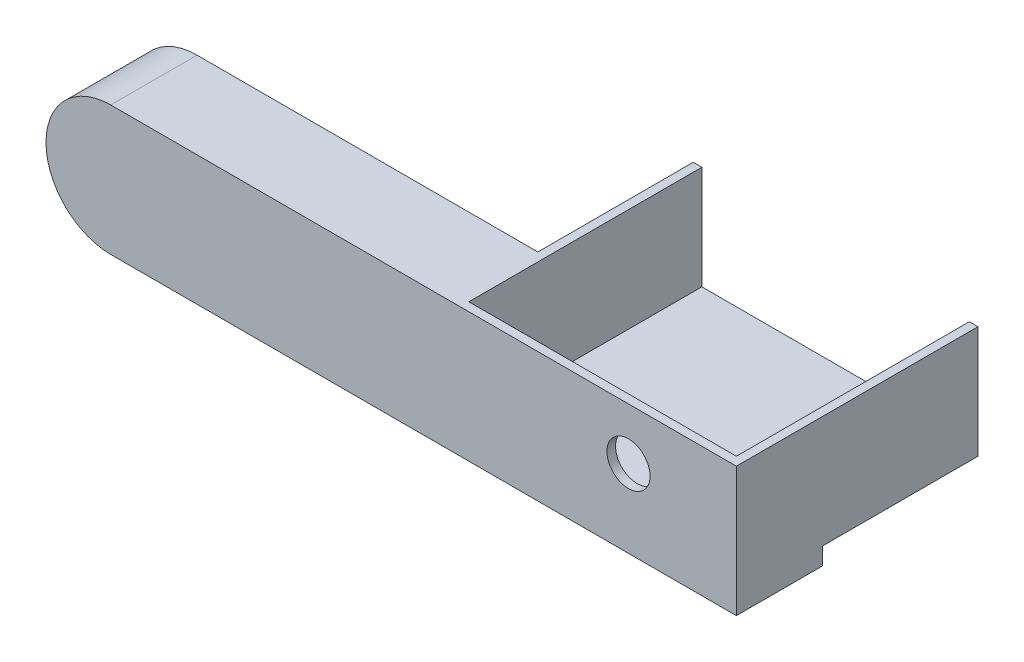
ISO-10303-21;
HEADER;
FILE_DESCRIPTION(('STEP AP214'),'2;1');
FILE_NAME('part.step','',(''),(''),'','','');
FILE_SCHEMA(('AUTOMOTIVE_DESIGN { 1 0 10303 214 1 1 1 1 }'));
ENDSEC;
DATA;
#1=APPLICATION_CONTEXT('core data for automotive mechanical design processes');
#2=APPLICATION_PROTOCOL_DEFINITION('international standard','automotive_design',2000,#1);
#3=PRODUCT_CONTEXT('',#1,'mechanical');
#4=PRODUCT('Part','Part','',(#3));
#5=PRODUCT_RELATED_PRODUCT_CATEGORY('part','',(#4));
#6=PRODUCT_DEFINITION_FORMATION('','',#4);
#7=PRODUCT_DEFINITION_CONTEXT('part definition',#1,'design');
#8=PRODUCT_DEFINITION('design','',#6,#7);
#9=PRODUCT_DEFINITION_SHAPE('','',#8);
#10=(LENGTH_UNIT() NAMED_UNIT(*) SI_UNIT(.MILLI.,.METRE.));
#11=(NAMED_UNIT(*) PLANE_ANGLE_UNIT() SI_UNIT($,.RADIAN.));
#12=(NAMED_UNIT(*) SI_UNIT($,.STERADIAN.) SOLID_ANGLE_UNIT());
#13=UNCERTAINTY_MEASURE_WITH_UNIT(LENGTH_MEASURE(1.E-05),#10,'distance_accuracy_value','');
#14=(GEOMETRIC_REPRESENTATION_CONTEXT(3) GLOBAL_UNCERTAINTY_ASSIGNED_CONTEXT((#13)) GLOBAL_UNIT_ASSIGNED_CONTEXT((#10,
#11,#12)) REPRESENTATION_CONTEXT('',''));
#15=CARTESIAN_POINT('',(0.,0.,0.));
#16=DIRECTION('',(0.,0.,1.));
#17=DIRECTION('',(1.,0.,0.));
#18=AXIS2_PLACEMENT_3D('',#15,#16,#17);
#19=CARTESIAN_POINT('',(47.,0.,-18.));
#20=DIRECTION('',(-1.,0.,0.));
#21=DIRECTION('',(0.,0.,1.));
#22=AXIS2_PLACEMENT_3D('',#19,#20,#21);
#23=PLANE('',#22);
#24=DIRECTION('',(0.,1.,0.));
#25=VECTOR('',#24,1.);
#26=CARTESIAN_POINT('',(47.,0.,-18.));
#27=LINE('',#26,#25);
#28=CARTESIAN_POINT('',(47.,2.,-18.));
#29=VERTEX_POINT('',#28);
#30=CARTESIAN_POINT('',(47.,15.,-18.));
#31=VERTEX_POINT('',#30);
#32=EDGE_CURVE('E159',#29,#31,#27,.T.);
#33=ORIENTED_EDGE('',*,*,#32,.F.);
#34=DIRECTION('',(0.,0.,-1.));
#35=VECTOR('',#34,1.);
#36=CARTESIAN_POINT('',(47.,2.,0.));
#37=LINE('',#36,#35);
#38=CARTESIAN_POINT('',(47.,2.,0.));
#39=VERTEX_POINT('',#38);
#40=EDGE_CURVE('E61',#39,#29,#37,.T.);
#41=ORIENTED_EDGE('',*,*,#40,.F.);
#42=DIRECTION('',(0.,1.,0.));
#43=VECTOR('',#42,1.);
#44=CARTESIAN_POINT('',(47.,0.,0.));
#45=LINE('',#44,#43);
#46=CARTESIAN_POINT('',(47.,15.,0.));
#47=VERTEX_POINT('',#46);
#48=EDGE_CURVE('E11',#39,#47,#45,.T.);
#49=ORIENTED_EDGE('',*,*,#48,.T.);
#50=DIRECTION('',(0.,0.,1.));
#51=VECTOR('',#50,1.);
#52=CARTESIAN_POINT('',(47.,15.,-18.));
#53=LINE('',#52,#51);
#54=EDGE_CURVE('E160',#31,#47,#53,.T.);
#55=ORIENTED_EDGE('',*,*,#54,.F.);
#56=EDGE_LOOP('',(#33,#41,#49,#55));
#57=FACE_BOUND('',#56,.T.);
#58=ADVANCED_FACE('F45',(#57),#23,.T.);
#59=CARTESIAN_POINT('',(47.,0.,-18.));
#60=DIRECTION('',(0.,0.,-1.));
#61=DIRECTION('',(-1.,0.,0.));
#62=AXIS2_PLACEMENT_3D('',#59,#60,#61);
#63=PLANE('',#62);
#64=DIRECTION('',(0.,1.,0.));
#65=VECTOR('',#64,1.);
#66=CARTESIAN_POINT('',(80.,0.,-18.));
#67=LINE('',#66,#65);
#68=CARTESIAN_POINT('',(80.,2.,-18.));
#69=VERTEX_POINT('',#68);
#70=CARTESIAN_POINT('',(80.,15.,-18.));
#71=VERTEX_POINT('',#70);
#72=EDGE_CURVE('E147',#69,#71,#67,.T.);
#73=ORIENTED_EDGE('',*,*,#72,.F.);
#74=DIRECTION('',(1.,0.,0.));
#75=VECTOR('',#74,1.);
#76=CARTESIAN_POINT('',(47.,2.,-18.));
#77=LINE('',#76,#75);
#78=EDGE_CURVE('E132',#29,#69,#77,.T.);
#79=ORIENTED_EDGE('',*,*,#78,.F.);
#80=ORIENTED_EDGE('',*,*,#32,.T.);
#81=DIRECTION('',(-1.,0.,0.));
#82=VECTOR('',#81,1.);
#83=CARTESIAN_POINT('',(47.,15.,-18.));
#84=LINE('',#83,#82);
#85=CARTESIAN_POINT('',(48.,15.,-18.));
#86=VERTEX_POINT('',#85);
#87=EDGE_CURVE('E297',#86,#31,#84,.T.);
#88=ORIENTED_EDGE('',*,*,#87,.F.);
#89=DIRECTION('',(0.,1.,0.));
#90=VECTOR('',#89,1.);
#91=CARTESIAN_POINT('',(48.,3.,-18.));
#92=LINE('',#91,#90);
#93=CARTESIAN_POINT('',(48.,3.,-18.));
#94=VERTEX_POINT('',#93);
#95=EDGE_CURVE('E301',#94,#86,#92,.T.);
#96=ORIENTED_EDGE('',*,*,#95,.F.);
#97=DIRECTION('',(-1.,0.,0.));
#98=VECTOR('',#97,1.);
#99=CARTESIAN_POINT('',(48.,3.,-18.));
#100=LINE('',#99,#98);
#101=CARTESIAN_POINT('',(79.,3.,-18.));
#102=VERTEX_POINT('',#101);
#103=EDGE_CURVE('E307',#102,#94,#100,.T.);
#104=ORIENTED_EDGE('',*,*,#103,.F.);
#105=DIRECTION('',(0.,1.,0.));
#106=VECTOR('',#105,1.);
#107=CARTESIAN_POINT('',(79.,3.,-18.));
#108=LINE('',#107,#106);
#109=CARTESIAN_POINT('',(79.,15.,-18.));
#110=VERTEX_POINT('',#109);
#111=EDGE_CURVE('E69',#102,#110,#108,.T.);
#112=ORIENTED_EDGE('',*,*,#111,.T.);
#113=EDGE_CURVE('E157',#71,#110,#84,.T.);
#114=ORIENTED_EDGE('',*,*,#113,.F.);
#115=EDGE_LOOP('',(#73,#79,#80,#88,#96,#104,#112,#114));
#116=FACE_BOUND('',#115,.T.);
#117=ADVANCED_FACE('F155',(#116),#63,.T.);
#118=CARTESIAN_POINT('',(0.,0.,10.));
#119=DIRECTION('',(0.,1.,0.));
#120=DIRECTION('',(0.,0.,1.));
#121=AXIS2_PLACEMENT_3D('',#118,#119,#120);
#122=PLANE('',#121);
#123=DIRECTION('',(1.,0.,0.));
#124=VECTOR('',#123,1.);
#125=CARTESIAN_POINT('',(0.,0.,0.));
#126=LINE('',#125,#124);
#127=CARTESIAN_POINT('',(7.5,0.,0.));
#128=VERTEX_POINT('',#127);
#129=CARTESIAN_POINT('',(80.,0.,0.));
#130=VERTEX_POINT('',#129);
#131=EDGE_CURVE('E188',#128,#130,#126,.T.);
#132=ORIENTED_EDGE('',*,*,#131,.T.);
#133=DIRECTION('',(0.,0.,-1.));
#134=VECTOR('',#133,1.);
#135=CARTESIAN_POINT('',(80.,0.,10.));
#136=LINE('',#135,#134);
#137=CARTESIAN_POINT('',(80.,0.,10.));
#138=VERTEX_POINT('',#137);
#139=EDGE_CURVE('E196',#138,#130,#136,.T.);
#140=ORIENTED_EDGE('',*,*,#139,.F.);
#141=DIRECTION('',(1.,0.,0.));
#142=VECTOR('',#141,1.);
#143=CARTESIAN_POINT('',(0.,0.,10.));
#144=LINE('',#143,#142);
#145=CARTESIAN_POINT('',(7.5,0.,10.));
#146=VERTEX_POINT('',#145);
#147=EDGE_CURVE('E177',#146,#138,#144,.T.);
#148=ORIENTED_EDGE('',*,*,#147,.F.);
#149=DIRECTION('',(0.,0.,-1.));
#150=VECTOR('',#149,1.);
#151=CARTESIAN_POINT('',(7.5,0.,10.));
#152=LINE('',#151,#150);
#153=EDGE_CURVE('E199',#146,#128,#152,.T.);
#154=ORIENTED_EDGE('',*,*,#153,.T.);
#155=EDGE_LOOP('',(#132,#140,#148,#154));
#156=FACE_BOUND('',#155,.T.);
#157=ADVANCED_FACE('F262',(#156),#122,.F.);
#158=CARTESIAN_POINT('',(80.,0.,10.));
#159=DIRECTION('',(-1.,0.,0.));
#160=DIRECTION('',(0.,0.,1.));
#161=AXIS2_PLACEMENT_3D('',#158,#159,#160);
#162=PLANE('',#161);
#163=ORIENTED_EDGE('',*,*,#139,.T.);
#164=DIRECTION('',(0.,-1.,0.));
#165=VECTOR('',#164,1.);
#166=CARTESIAN_POINT('',(80.,2.,0.));
#167=LINE('',#166,#165);
#168=CARTESIAN_POINT('',(80.,2.,0.));
#169=VERTEX_POINT('',#168);
#170=EDGE_CURVE('E150',#169,#130,#167,.T.);
#171=ORIENTED_EDGE('',*,*,#170,.F.);
#172=DIRECTION('',(0.,0.,1.));
#173=VECTOR('',#172,1.);
#174=CARTESIAN_POINT('',(80.,2.,0.));
#175=LINE('',#174,#173);
#176=EDGE_CURVE('E135',#69,#169,#175,.T.);
#177=ORIENTED_EDGE('',*,*,#176,.F.);
#178=ORIENTED_EDGE('',*,*,#72,.T.);
#179=DIRECTION('',(0.,0.,-1.));
#180=VECTOR('',#179,1.);
#181=CARTESIAN_POINT('',(80.,15.,10.));
#182=LINE('',#181,#180);
#183=CARTESIAN_POINT('',(80.,15.,10.));
#184=VERTEX_POINT('',#183);
#185=EDGE_CURVE('E187',#184,#71,#182,.T.);
#186=ORIENTED_EDGE('',*,*,#185,.F.);
#187=DIRECTION('',(0.,1.,0.));
#188=VECTOR('',#187,1.);
#189=CARTESIAN_POINT('',(80.,0.,10.));
#190=LINE('',#189,#188);
#191=EDGE_CURVE('E180',#138,#184,#190,.T.);
#192=ORIENTED_EDGE('',*,*,#191,.F.);
#193=EDGE_LOOP('',(#163,#171,#177,#178,#186,#192));
#194=FACE_BOUND('',#193,.T.);
#195=ADVANCED_FACE('F145',(#194),#162,.F.);
#196=CARTESIAN_POINT('',(0.,15.,10.));
#197=DIRECTION('',(0.,-1.,0.));
#198=DIRECTION('',(0.,0.,-1.));
#199=AXIS2_PLACEMENT_3D('',#196,#197,#198);
#200=PLANE('',#199);
#201=ORIENTED_EDGE('',*,*,#113,.T.);
#202=DIRECTION('',(0.,0.,-1.));
#203=VECTOR('',#202,1.);
#204=CARTESIAN_POINT('',(79.,15.,-17.));
#205=LINE('',#204,#203);
#206=CARTESIAN_POINT('',(79.,15.,9.));
#207=VERTEX_POINT('',#206);
#208=EDGE_CURVE('E294',#207,#110,#205,.T.);
#209=ORIENTED_EDGE('',*,*,#208,.F.);
#210=DIRECTION('',(1.,0.,0.));
#211=VECTOR('',#210,1.);
#212=CARTESIAN_POINT('',(48.,15.,9.));
#213=LINE('',#212,#211);
#214=CARTESIAN_POINT('',(48.,15.,9.));
#215=VERTEX_POINT('',#214);
#216=EDGE_CURVE('E317',#215,#207,#213,.T.);
#217=ORIENTED_EDGE('',*,*,#216,.F.);
#218=DIRECTION('',(0.,0.,1.));
#219=VECTOR('',#218,1.);
#220=CARTESIAN_POINT('',(48.,15.,-17.));
#221=LINE('',#220,#219);
#222=EDGE_CURVE('E321',#86,#215,#221,.T.);
#223=ORIENTED_EDGE('',*,*,#222,.F.);
#224=ORIENTED_EDGE('',*,*,#87,.T.);
#225=ORIENTED_EDGE('',*,*,#54,.T.);
#226=DIRECTION('',(-1.,0.,0.));
#227=VECTOR('',#226,1.);
#228=CARTESIAN_POINT('',(0.,15.,0.));
#229=LINE('',#228,#227);
#230=CARTESIAN_POINT('',(7.5,15.,0.));
#231=VERTEX_POINT('',#230);
#232=EDGE_CURVE('E181',#47,#231,#229,.T.);
#233=ORIENTED_EDGE('',*,*,#232,.T.);
#234=DIRECTION('',(0.,0.,-1.));
#235=VECTOR('',#234,1.);
#236=CARTESIAN_POINT('',(7.5,15.,10.));
#237=LINE('',#236,#235);
#238=CARTESIAN_POINT('',(7.5,15.,10.));
#239=VERTEX_POINT('',#238);
#240=EDGE_CURVE('E216',#231,#239,#237,.F.);
#241=ORIENTED_EDGE('',*,*,#240,.T.);
#242=DIRECTION('',(-1.,0.,0.));
#243=VECTOR('',#242,1.);
#244=CARTESIAN_POINT('',(0.,15.,10.));
#245=LINE('',#244,#243);
#246=EDGE_CURVE('E184',#184,#239,#245,.T.);
#247=ORIENTED_EDGE('',*,*,#246,.F.);
#248=ORIENTED_EDGE('',*,*,#185,.T.);
#249=EDGE_LOOP('',(#201,#209,#217,#223,#224,#225,#233,#241,#247,#248));
#250=FACE_BOUND('',#249,.T.);
#251=ADVANCED_FACE('F246',(#250),#200,.F.);
#252=CARTESIAN_POINT('',(0.,0.,10.));
#253=DIRECTION('',(0.,0.,-1.));
#254=DIRECTION('',(-1.,0.,0.));
#255=AXIS2_PLACEMENT_3D('',#252,#253,#254);
#256=PLANE('',#255);
#257=CARTESIAN_POINT('',(67.5,9.,10.));
#258=DIRECTION('',(0.,0.,-1.));
#259=DIRECTION('',(-1.,0.,0.));
#260=AXIS2_PLACEMENT_3D('',#257,#258,#259);
#261=CIRCLE('',#260,2.5);
#262=CARTESIAN_POINT('',(65.,9.,10.));
#263=VERTEX_POINT('',#262);
#264=EDGE_CURVE('E343',#263,#263,#261,.T.);
#265=ORIENTED_EDGE('',*,*,#264,.T.);
#266=EDGE_LOOP('',(#265));
#267=FACE_BOUND('',#266,.T.);
#268=ORIENTED_EDGE('',*,*,#147,.T.);
#269=ORIENTED_EDGE('',*,*,#191,.T.);
#270=ORIENTED_EDGE('',*,*,#246,.T.);
#271=CARTESIAN_POINT('',(7.5,7.5,10.));
#272=DIRECTION('',(0.,0.,-1.));
#273=DIRECTION('',(-1.,0.,0.));
#274=AXIS2_PLACEMENT_3D('',#271,#272,#273);
#275=CIRCLE('',#274,7.5);
#276=CARTESIAN_POINT('',(0.,7.5,10.));
#277=VERTEX_POINT('',#276);
#278=EDGE_CURVE('E210',#239,#277,#275,.F.);
#279=ORIENTED_EDGE('',*,*,#278,.T.);
#280=CARTESIAN_POINT('',(7.5,7.5,10.));
#281=DIRECTION('',(0.,0.,-1.));
#282=DIRECTION('',(-1.,0.,0.));
#283=AXIS2_PLACEMENT_3D('',#280,#281,#282);
#284=CIRCLE('',#283,7.5);
#285=EDGE_CURVE('E213',#277,#146,#284,.F.);
#286=ORIENTED_EDGE('',*,*,#285,.T.);
#287=EDGE_LOOP('',(#268,#269,#270,#279,#286));
#288=FACE_BOUND('',#287,.T.);
#289=ADVANCED_FACE('F234',(#267,#288),#256,.F.);
#290=CARTESIAN_POINT('',(0.,0.,0.));
#291=DIRECTION('',(0.,0.,-1.));
#292=DIRECTION('',(-1.,0.,0.));
#293=AXIS2_PLACEMENT_3D('',#290,#291,#292);
#294=PLANE('',#293);
#295=ORIENTED_EDGE('',*,*,#48,.F.);
#296=DIRECTION('',(-1.,0.,0.));
#297=VECTOR('',#296,1.);
#298=CARTESIAN_POINT('',(47.,2.,0.));
#299=LINE('',#298,#297);
#300=EDGE_CURVE('E152',#169,#39,#299,.T.);
#301=ORIENTED_EDGE('',*,*,#300,.F.);
#302=ORIENTED_EDGE('',*,*,#170,.T.);
#303=ORIENTED_EDGE('',*,*,#131,.F.);
#304=CARTESIAN_POINT('',(7.5,7.5,0.));
#305=DIRECTION('',(0.,0.,-1.));
#306=DIRECTION('',(-1.,0.,0.));
#307=AXIS2_PLACEMENT_3D('',#304,#305,#306);
#308=CIRCLE('',#307,7.5);
#309=CARTESIAN_POINT('',(0.,7.5,0.));
#310=VERTEX_POINT('',#309);
#311=EDGE_CURVE('E207',#128,#310,#308,.T.);
#312=ORIENTED_EDGE('',*,*,#311,.T.);
#313=CARTESIAN_POINT('',(7.5,7.5,0.));
#314=DIRECTION('',(0.,0.,-1.));
#315=DIRECTION('',(-1.,0.,0.));
#316=AXIS2_PLACEMENT_3D('',#313,#314,#315);
#317=CIRCLE('',#316,7.5);
#318=EDGE_CURVE('E203',#310,#231,#317,.T.);
#319=ORIENTED_EDGE('',*,*,#318,.T.);
#320=ORIENTED_EDGE('',*,*,#232,.F.);
#321=EDGE_LOOP('',(#295,#301,#302,#303,#312,#319,#320));
#322=FACE_BOUND('',#321,.T.);
#323=CARTESIAN_POINT('',(7.5,7.5,0.));
#324=DIRECTION('',(0.,0.,-1.));
#325=DIRECTION('',(-1.,0.,0.));
#326=AXIS2_PLACEMENT_3D('',#323,#324,#325);
#327=CIRCLE('',#326,3.5);
#328=CARTESIAN_POINT('',(11.,7.5,0.));
#329=VERTEX_POINT('',#328);
#330=EDGE_CURVE('E54',#329,#329,#327,.T.);
#331=ORIENTED_EDGE('',*,*,#330,.F.);
#332=EDGE_LOOP('',(#331));
#333=FACE_BOUND('',#332,.T.);
#334=ADVANCED_FACE('F232',(#322,#333),#294,.T.);
#335=CARTESIAN_POINT('',(7.5,7.5,10.));
#336=DIRECTION('',(0.,0.,-1.));
#337=DIRECTION('',(-1.,0.,0.));
#338=AXIS2_PLACEMENT_3D('',#335,#336,#337);
#339=CYLINDRICAL_SURFACE('',#338,7.5);
#340=DIRECTION('',(0.,0.,-1.));
#341=VECTOR('',#340,1.);
#342=CARTESIAN_POINT('',(0.,7.5,10.));
#343=LINE('',#342,#341);
#344=EDGE_CURVE('E191',#277,#310,#343,.T.);
#345=ORIENTED_EDGE('',*,*,#344,.F.);
#346=ORIENTED_EDGE('',*,*,#278,.F.);
#347=ORIENTED_EDGE('',*,*,#240,.F.);
#348=ORIENTED_EDGE('',*,*,#318,.F.);
#349=EDGE_LOOP('',(#345,#346,#347,#348));
#350=FACE_BOUND('',#349,.T.);
#351=ADVANCED_FACE('F47',(#350),#339,.T.);
#352=CARTESIAN_POINT('',(7.5,7.5,10.));
#353=DIRECTION('',(0.,0.,-1.));
#354=DIRECTION('',(-1.,0.,0.));
#355=AXIS2_PLACEMENT_3D('',#352,#353,#354);
#356=CYLINDRICAL_SURFACE('',#355,7.5);
#357=ORIENTED_EDGE('',*,*,#285,.F.);
#358=ORIENTED_EDGE('',*,*,#344,.T.);
#359=ORIENTED_EDGE('',*,*,#311,.F.);
#360=ORIENTED_EDGE('',*,*,#153,.F.);
#361=EDGE_LOOP('',(#357,#358,#359,#360));
#362=FACE_BOUND('',#361,.T.);
#363=ADVANCED_FACE('F243',(#362),#356,.T.);
#364=CARTESIAN_POINT('',(7.5,7.5,-3.));
#365=DIRECTION('',(0.,0.,1.));
#366=DIRECTION('',(1.,0.,0.));
#367=AXIS2_PLACEMENT_3D('',#364,#365,#366);
#368=CYLINDRICAL_SURFACE('',#367,3.5);
#369=CARTESIAN_POINT('',(7.5,7.5,-3.));
#370=DIRECTION('',(0.,0.,1.));
#371=DIRECTION('',(1.,0.,0.));
#372=AXIS2_PLACEMENT_3D('',#369,#370,#371);
#373=CIRCLE('',#372,3.5);
#374=CARTESIAN_POINT('',(11.,7.5,-3.));
#375=VERTEX_POINT('',#374);
#376=EDGE_CURVE('E172',#375,#375,#373,.T.);
#377=CARTESIAN_POINT('',(11.,7.5,0.));
#378=CARTESIAN_POINT('',(11.,7.5,-0.0312499999999996));
#379=CARTESIAN_POINT('',(11.,7.5,-0.0624999999999996));
#380=CARTESIAN_POINT('',(11.,7.5,-0.125));
#381=CARTESIAN_POINT('',(11.,7.5,-0.15625));
#382=CARTESIAN_POINT('',(11.,7.5,-0.21875));
#383=CARTESIAN_POINT('',(11.,7.5,-0.25));
#384=CARTESIAN_POINT('',(11.,7.5,-0.3125));
#385=CARTESIAN_POINT('',(11.,7.5,-0.34375));
#386=CARTESIAN_POINT('',(11.,7.5,-0.40625));
#387=CARTESIAN_POINT('',(11.,7.5,-0.4375));
#388=CARTESIAN_POINT('',(11.,7.5,-0.5));
#389=CARTESIAN_POINT('',(11.,7.5,-0.53125));
#390=CARTESIAN_POINT('',(11.,7.5,-0.59375));
#391=CARTESIAN_POINT('',(11.,7.5,-0.625));
#392=CARTESIAN_POINT('',(11.,7.5,-0.6875));
#393=CARTESIAN_POINT('',(11.,7.5,-0.718749999999999));
#394=CARTESIAN_POINT('',(11.,7.5,-0.781249999999999));
#395=CARTESIAN_POINT('',(11.,7.5,-0.812499999999999));
#396=CARTESIAN_POINT('',(11.,7.5,-0.874999999999999));
#397=CARTESIAN_POINT('',(11.,7.5,-0.90625));
#398=CARTESIAN_POINT('',(11.,7.5,-0.96875));
#399=CARTESIAN_POINT('',(11.,7.5,-1.));
#400=CARTESIAN_POINT('',(11.,7.5,-1.0625));
#401=CARTESIAN_POINT('',(11.,7.5,-1.09375));
#402=CARTESIAN_POINT('',(11.,7.5,-1.15625));
#403=CARTESIAN_POINT('',(11.,7.5,-1.1875));
#404=CARTESIAN_POINT('',(11.,7.5,-1.25));
#405=CARTESIAN_POINT('',(11.,7.5,-1.28125));
#406=CARTESIAN_POINT('',(11.,7.5,-1.34375));
#407=CARTESIAN_POINT('',(11.,7.5,-1.375));
#408=CARTESIAN_POINT('',(11.,7.5,-1.4375));
#409=CARTESIAN_POINT('',(11.,7.5,-1.46875));
#410=CARTESIAN_POINT('',(11.,7.5,-1.53125));
#411=CARTESIAN_POINT('',(11.,7.5,-1.5625));
#412=CARTESIAN_POINT('',(11.,7.5,-1.625));
#413=CARTESIAN_POINT('',(11.,7.5,-1.65625));
#414=CARTESIAN_POINT('',(11.,7.5,-1.71875));
#415=CARTESIAN_POINT('',(11.,7.5,-1.75));
#416=CARTESIAN_POINT('',(11.,7.5,-1.8125));
#417=CARTESIAN_POINT('',(11.,7.5,-1.84375));
#418=CARTESIAN_POINT('',(11.,7.5,-1.90625));
#419=CARTESIAN_POINT('',(11.,7.5,-1.9375));
#420=CARTESIAN_POINT('',(11.,7.5,-2.));
#421=CARTESIAN_POINT('',(11.,7.5,-2.03125));
#422=CARTESIAN_POINT('',(11.,7.5,-2.09375));
#423=CARTESIAN_POINT('',(11.,7.5,-2.125));
#424=CARTESIAN_POINT('',(11.,7.5,-2.1875));
#425=CARTESIAN_POINT('',(11.,7.5,-2.21875));
#426=CARTESIAN_POINT('',(11.,7.5,-2.28125));
#427=CARTESIAN_POINT('',(11.,7.5,-2.3125));
#428=CARTESIAN_POINT('',(11.,7.5,-2.375));
#429=CARTESIAN_POINT('',(11.,7.5,-2.40625));
#430=CARTESIAN_POINT('',(11.,7.5,-2.46875));
#431=CARTESIAN_POINT('',(11.,7.5,-2.5));
#432=CARTESIAN_POINT('',(11.,7.5,-2.5625));
#433=CARTESIAN_POINT('',(11.,7.5,-2.59375));
#434=CARTESIAN_POINT('',(11.,7.5,-2.65625));
#435=CARTESIAN_POINT('',(11.,7.5,-2.6875));
#436=CARTESIAN_POINT('',(11.,7.5,-2.75));
#437=CARTESIAN_POINT('',(11.,7.5,-2.78125));
#438=CARTESIAN_POINT('',(11.,7.5,-2.84375));
#439=CARTESIAN_POINT('',(11.,7.5,-2.875));
#440=CARTESIAN_POINT('',(11.,7.5,-2.9375));
#441=CARTESIAN_POINT('',(11.,7.5,-2.96875));
#442=CARTESIAN_POINT('',(11.,7.5,-3.));
#443=B_SPLINE_CURVE_WITH_KNOTS('',3,(#377,#378,#379,#380,#381,#382,#383,#384,#385,#386,#387,
#388,#389,#390,#391,#392,#393,#394,#395,#396,#397,#398,#399,#400,#401,#402,#403,#404,#405,#406,
#407,#408,#409,#410,#411,#412,#413,#414,#415,#416,#417,#418,#419,#420,#421,#422,#423,#424,#425,
#426,#427,#428,#429,#430,#431,#432,#433,#434,#435,#436,#437,#438,#439,#440,#441,#442),
.UNSPECIFIED.,.F.,.F.,(4,2,2,2,2,2,2,2,2,2,2,2,2,2,2,2,2,2,2,2,2,2,2,2,2,2,2,2,2,2,2,2,4),(0.,
0.0937500000000001,0.1875,0.28125,0.375,0.46875,0.5625,0.65625,0.75,0.84375,0.9375,1.03125,
1.125,1.21875,1.3125,1.40625,1.5,1.59375,1.6875,1.78125,1.875,1.96875,2.0625,2.15625,2.25,
2.34375,2.4375,2.53125,2.625,2.71875,2.8125,2.90625,3.),.UNSPECIFIED.);
#444=EDGE_CURVE('BSEAM229',#329,#375,#443,.T.);
#445=ORIENTED_EDGE('',*,*,#330,.T.);
#446=ORIENTED_EDGE('',*,*,#376,.T.);
#447=ORIENTED_EDGE('',*,*,#444,.T.);
#448=ORIENTED_EDGE('',*,*,#444,.F.);
#449=EDGE_LOOP('',(#445,#447,#446,#448));
#450=FACE_BOUND('',#449,.T.);
#451=ADVANCED_FACE('F229',(#450),#368,.T.);
#452=CARTESIAN_POINT('',(7.5,7.5,-3.));
#453=DIRECTION('',(0.,0.,1.));
#454=DIRECTION('',(1.,0.,0.));
#455=AXIS2_PLACEMENT_3D('',#452,#453,#454);
#456=PLANE('',#455);
#457=CARTESIAN_POINT('',(7.5,7.5,-3.));
#458=DIRECTION('',(0.,0.,1.));
#459=DIRECTION('',(1.,0.,0.));
#460=AXIS2_PLACEMENT_3D('',#457,#458,#459);
#461=CIRCLE('',#460,2.5);
#462=CARTESIAN_POINT('',(10.,7.5,-3.));
#463=VERTEX_POINT('',#462);
#464=EDGE_CURVE('E164',#463,#463,#461,.T.);
#465=ORIENTED_EDGE('',*,*,#464,.T.);
#466=EDGE_LOOP('',(#465));
#467=FACE_BOUND('',#466,.T.);
#468=ORIENTED_EDGE('',*,*,#376,.F.);
#469=EDGE_LOOP('',(#468));
#470=FACE_BOUND('',#469,.T.);
#471=ADVANCED_FACE('F270',(#467,#470),#456,.F.);
#472=CARTESIAN_POINT('',(7.5,7.5,-3.));
#473=DIRECTION('',(0.,0.,1.));
#474=DIRECTION('',(1.,0.,0.));
#475=AXIS2_PLACEMENT_3D('',#472,#473,#474);
#476=CYLINDRICAL_SURFACE('',#475,2.5);
#477=CARTESIAN_POINT('',(7.5,7.5,0.));
#478=DIRECTION('',(0.,0.,-1.));
#479=DIRECTION('',(-1.,0.,0.));
#480=AXIS2_PLACEMENT_3D('',#477,#478,#479);
#481=CIRCLE('',#480,2.5);
#482=CARTESIAN_POINT('',(10.,7.5,0.));
#483=VERTEX_POINT('',#482);
#484=EDGE_CURVE('E176',#483,#483,#481,.T.);
#485=CARTESIAN_POINT('',(10.,7.5,0.));
#486=CARTESIAN_POINT('',(10.,7.5,-0.0312499999999996));
#487=CARTESIAN_POINT('',(10.,7.5,-0.0624999999999996));
#488=CARTESIAN_POINT('',(10.,7.5,-0.125));
#489=CARTESIAN_POINT('',(10.,7.5,-0.15625));
#490=CARTESIAN_POINT('',(10.,7.5,-0.21875));
#491=CARTESIAN_POINT('',(10.,7.5,-0.25));
#492=CARTESIAN_POINT('',(10.,7.5,-0.3125));
#493=CARTESIAN_POINT('',(10.,7.5,-0.34375));
#494=CARTESIAN_POINT('',(10.,7.5,-0.40625));
#495=CARTESIAN_POINT('',(10.,7.5,-0.4375));
#496=CARTESIAN_POINT('',(10.,7.5,-0.5));
#497=CARTESIAN_POINT('',(10.,7.5,-0.53125));
#498=CARTESIAN_POINT('',(10.,7.5,-0.59375));
#499=CARTESIAN_POINT('',(10.,7.5,-0.625));
#500=CARTESIAN_POINT('',(10.,7.5,-0.6875));
#501=CARTESIAN_POINT('',(10.,7.5,-0.718749999999999));
#502=CARTESIAN_POINT('',(10.,7.5,-0.781249999999999));
#503=CARTESIAN_POINT('',(10.,7.5,-0.812499999999999));
#504=CARTESIAN_POINT('',(10.,7.5,-0.874999999999999));
#505=CARTESIAN_POINT('',(10.,7.5,-0.90625));
#506=CARTESIAN_POINT('',(10.,7.5,-0.96875));
#507=CARTESIAN_POINT('',(10.,7.5,-1.));
#508=CARTESIAN_POINT('',(10.,7.5,-1.0625));
#509=CARTESIAN_POINT('',(10.,7.5,-1.09375));
#510=CARTESIAN_POINT('',(10.,7.5,-1.15625));
#511=CARTESIAN_POINT('',(10.,7.5,-1.1875));
#512=CARTESIAN_POINT('',(10.,7.5,-1.25));
#513=CARTESIAN_POINT('',(10.,7.5,-1.28125));
#514=CARTESIAN_POINT('',(10.,7.5,-1.34375));
#515=CARTESIAN_POINT('',(10.,7.5,-1.375));
#516=CARTESIAN_POINT('',(10.,7.5,-1.4375));
#517=CARTESIAN_POINT('',(10.,7.5,-1.46875));
#518=CARTESIAN_POINT('',(10.,7.5,-1.53125));
#519=CARTESIAN_POINT('',(10.,7.5,-1.5625));
#520=CARTESIAN_POINT('',(10.,7.5,-1.625));
#521=CARTESIAN_POINT('',(10.,7.5,-1.65625));
#522=CARTESIAN_POINT('',(10.,7.5,-1.71875));
#523=CARTESIAN_POINT('',(10.,7.5,-1.75));
#524=CARTESIAN_POINT('',(10.,7.5,-1.8125));
#525=CARTESIAN_POINT('',(10.,7.5,-1.84375));
#526=CARTESIAN_POINT('',(10.,7.5,-1.90625));
#527=CARTESIAN_POINT('',(10.,7.5,-1.9375));
#528=CARTESIAN_POINT('',(10.,7.5,-2.));
#529=CARTESIAN_POINT('',(10.,7.5,-2.03125));
#530=CARTESIAN_POINT('',(10.,7.5,-2.09375));
#531=CARTESIAN_POINT('',(10.,7.5,-2.125));
#532=CARTESIAN_POINT('',(10.,7.5,-2.1875));
#533=CARTESIAN_POINT('',(10.,7.5,-2.21875));
#534=CARTESIAN_POINT('',(10.,7.5,-2.28125));
#535=CARTESIAN_POINT('',(10.,7.5,-2.3125));
#536=CARTESIAN_POINT('',(10.,7.5,-2.375));
#537=CARTESIAN_POINT('',(10.,7.5,-2.40625));
#538=CARTESIAN_POINT('',(10.,7.5,-2.46875));
#539=CARTESIAN_POINT('',(10.,7.5,-2.5));
#540=CARTESIAN_POINT('',(10.,7.5,-2.5625));
#541=CARTESIAN_POINT('',(10.,7.5,-2.59375));
#542=CARTESIAN_POINT('',(10.,7.5,-2.65625));
#543=CARTESIAN_POINT('',(10.,7.5,-2.6875));
#544=CARTESIAN_POINT('',(10.,7.5,-2.75));
#545=CARTESIAN_POINT('',(10.,7.5,-2.78125));
#546=CARTESIAN_POINT('',(10.,7.5,-2.84375));
#547=CARTESIAN_POINT('',(10.,7.5,-2.875));
#548=CARTESIAN_POINT('',(10.,7.5,-2.9375));
#549=CARTESIAN_POINT('',(10.,7.5,-2.96875));
#550=CARTESIAN_POINT('',(10.,7.5,-3.));
#551=B_SPLINE_CURVE_WITH_KNOTS('',3,(#485,#486,#487,#488,#489,#490,#491,#492,#493,#494,#495,
#496,#497,#498,#499,#500,#501,#502,#503,#504,#505,#506,#507,#508,#509,#510,#511,#512,#513,#514,
#515,#516,#517,#518,#519,#520,#521,#522,#523,#524,#525,#526,#527,#528,#529,#530,#531,#532,#533,
#534,#535,#536,#537,#538,#539,#540,#541,#542,#543,#544,#545,#546,#547,#548,#549,#550),
.UNSPECIFIED.,.F.,.F.,(4,2,2,2,2,2,2,2,2,2,2,2,2,2,2,2,2,2,2,2,2,2,2,2,2,2,2,2,2,2,2,2,4),(0.,
0.0937500000000001,0.1875,0.28125,0.375,0.46875,0.5625,0.65625,0.75,0.84375,0.9375,1.03125,
1.125,1.21875,1.3125,1.40625,1.5,1.59375,1.6875,1.78125,1.875,1.96875,2.0625,2.15625,2.25,
2.34375,2.4375,2.53125,2.625,2.71875,2.8125,2.90625,3.),.UNSPECIFIED.);
#552=EDGE_CURVE('BSEAM253',#483,#463,#551,.T.);
#553=ORIENTED_EDGE('',*,*,#484,.F.);
#554=ORIENTED_EDGE('',*,*,#464,.F.);
#555=ORIENTED_EDGE('',*,*,#552,.T.);
#556=ORIENTED_EDGE('',*,*,#552,.F.);
#557=EDGE_LOOP('',(#553,#555,#554,#556));
#558=FACE_BOUND('',#557,.T.);
#559=ADVANCED_FACE('F253',(#558),#476,.F.);
#560=ORIENTED_EDGE('',*,*,#484,.T.);
#561=EDGE_LOOP('',(#560));
#562=FACE_BOUND('',#561,.T.);
#563=ADVANCED_FACE('F237',(#562),#294,.T.);
#564=CARTESIAN_POINT('',(79.,3.,-17.));
#565=DIRECTION('',(1.,0.,0.));
#566=DIRECTION('',(0.,0.,-1.));
#567=AXIS2_PLACEMENT_3D('',#564,#565,#566);
#568=PLANE('',#567);
#569=ORIENTED_EDGE('',*,*,#208,.T.);
#570=ORIENTED_EDGE('',*,*,#111,.F.);
#571=DIRECTION('',(0.,0.,-1.));
#572=VECTOR('',#571,1.);
#573=CARTESIAN_POINT('',(79.,3.,-17.));
#574=LINE('',#573,#572);
#575=CARTESIAN_POINT('',(79.,3.,9.));
#576=VERTEX_POINT('',#575);
#577=EDGE_CURVE('E328',#576,#102,#574,.T.);
#578=ORIENTED_EDGE('',*,*,#577,.F.);
#579=DIRECTION('',(0.,1.,0.));
#580=VECTOR('',#579,1.);
#581=CARTESIAN_POINT('',(79.,3.,9.));
#582=LINE('',#581,#580);
#583=EDGE_CURVE('E306',#576,#207,#582,.T.);
#584=ORIENTED_EDGE('',*,*,#583,.T.);
#585=EDGE_LOOP('',(#569,#570,#578,#584));
#586=FACE_BOUND('',#585,.T.);
#587=ADVANCED_FACE('F252',(#586),#568,.F.);
#588=CARTESIAN_POINT('',(48.,3.,9.));
#589=DIRECTION('',(0.,0.,1.));
#590=DIRECTION('',(1.,0.,0.));
#591=AXIS2_PLACEMENT_3D('',#588,#589,#590);
#592=PLANE('',#591);
#593=CARTESIAN_POINT('',(67.5,9.,9.));
#594=DIRECTION('',(0.,0.,-1.));
#595=DIRECTION('',(-1.,0.,0.));
#596=AXIS2_PLACEMENT_3D('',#593,#594,#595);
#597=CIRCLE('',#596,2.5);
#598=CARTESIAN_POINT('',(65.,9.,9.));
#599=VERTEX_POINT('',#598);
#600=EDGE_CURVE('E344',#599,#599,#597,.T.);
#601=ORIENTED_EDGE('',*,*,#600,.F.);
#602=EDGE_LOOP('',(#601));
#603=FACE_BOUND('',#602,.T.);
#604=ORIENTED_EDGE('',*,*,#216,.T.);
#605=ORIENTED_EDGE('',*,*,#583,.F.);
#606=DIRECTION('',(1.,0.,0.));
#607=VECTOR('',#606,1.);
#608=CARTESIAN_POINT('',(48.,3.,9.));
#609=LINE('',#608,#607);
#610=CARTESIAN_POINT('',(48.,3.,9.));
#611=VERTEX_POINT('',#610);
#612=EDGE_CURVE('E331',#611,#576,#609,.T.);
#613=ORIENTED_EDGE('',*,*,#612,.F.);
#614=DIRECTION('',(0.,1.,0.));
#615=VECTOR('',#614,1.);
#616=CARTESIAN_POINT('',(48.,3.,9.));
#617=LINE('',#616,#615);
#618=EDGE_CURVE('E303',#611,#215,#617,.T.);
#619=ORIENTED_EDGE('',*,*,#618,.T.);
#620=EDGE_LOOP('',(#604,#605,#613,#619));
#621=FACE_BOUND('',#620,.T.);
#622=ADVANCED_FACE('F359',(#603,#621),#592,.F.);
#623=CARTESIAN_POINT('',(48.,3.,-17.));
#624=DIRECTION('',(-1.,0.,0.));
#625=DIRECTION('',(0.,0.,1.));
#626=AXIS2_PLACEMENT_3D('',#623,#624,#625);
#627=PLANE('',#626);
#628=ORIENTED_EDGE('',*,*,#222,.T.);
#629=ORIENTED_EDGE('',*,*,#618,.F.);
#630=DIRECTION('',(0.,0.,1.));
#631=VECTOR('',#630,1.);
#632=CARTESIAN_POINT('',(48.,3.,-17.));
#633=LINE('',#632,#631);
#634=EDGE_CURVE('E316',#94,#611,#633,.T.);
#635=ORIENTED_EDGE('',*,*,#634,.F.);
#636=ORIENTED_EDGE('',*,*,#95,.T.);
#637=EDGE_LOOP('',(#628,#629,#635,#636));
#638=FACE_BOUND('',#637,.T.);
#639=ADVANCED_FACE('F265',(#638),#627,.F.);
#640=CARTESIAN_POINT('',(0.,3.,0.));
#641=DIRECTION('',(0.,-1.,0.));
#642=DIRECTION('',(0.,0.,-1.));
#643=AXIS2_PLACEMENT_3D('',#640,#641,#642);
#644=PLANE('',#643);
#645=ORIENTED_EDGE('',*,*,#634,.T.);
#646=ORIENTED_EDGE('',*,*,#612,.T.);
#647=ORIENTED_EDGE('',*,*,#577,.T.);
#648=ORIENTED_EDGE('',*,*,#103,.T.);
#649=EDGE_LOOP('',(#645,#646,#647,#648));
#650=FACE_BOUND('',#649,.T.);
#651=ADVANCED_FACE('F381',(#650),#644,.F.);
#652=CARTESIAN_POINT('',(0.,2.,0.));
#653=DIRECTION('',(0.,-1.,0.));
#654=DIRECTION('',(0.,0.,-1.));
#655=AXIS2_PLACEMENT_3D('',#652,#653,#654);
#656=PLANE('',#655);
#657=ORIENTED_EDGE('',*,*,#40,.T.);
#658=ORIENTED_EDGE('',*,*,#78,.T.);
#659=ORIENTED_EDGE('',*,*,#176,.T.);
#660=ORIENTED_EDGE('',*,*,#300,.T.);
#661=EDGE_LOOP('',(#657,#658,#659,#660));
#662=FACE_BOUND('',#661,.T.);
#663=ADVANCED_FACE('F134',(#662),#656,.T.);
#664=CARTESIAN_POINT('',(67.5,9.,10.));
#665=DIRECTION('',(0.,0.,-1.));
#666=DIRECTION('',(-1.,0.,0.));
#667=AXIS2_PLACEMENT_3D('',#664,#665,#666);
#668=CYLINDRICAL_SURFACE('',#667,2.5);
#669=ORIENTED_EDGE('',*,*,#264,.F.);
#670=EDGE_LOOP('',(#669));
#671=FACE_BOUND('',#670,.T.);
#672=ORIENTED_EDGE('',*,*,#600,.T.);
#673=EDGE_LOOP('',(#672));
#674=FACE_BOUND('',#673,.T.);
#675=ADVANCED_FACE('F353',(#671,#674),#668,.F.);
#676=CLOSED_SHELL('',(#58,#117,#157,#195,#251,#289,#334,#351,#363,#451,#471,#559,#563,#587,#622,
#639,#651,#663,#675));
#677=MANIFOLD_SOLID_BREP('B2',#676);
#678=ADVANCED_BREP_SHAPE_REPRESENTATION('',(#18,#677),#14);
#679=SHAPE_DEFINITION_REPRESENTATION(#9,#678);
ENDSEC;
END-ISO-10303-21;
